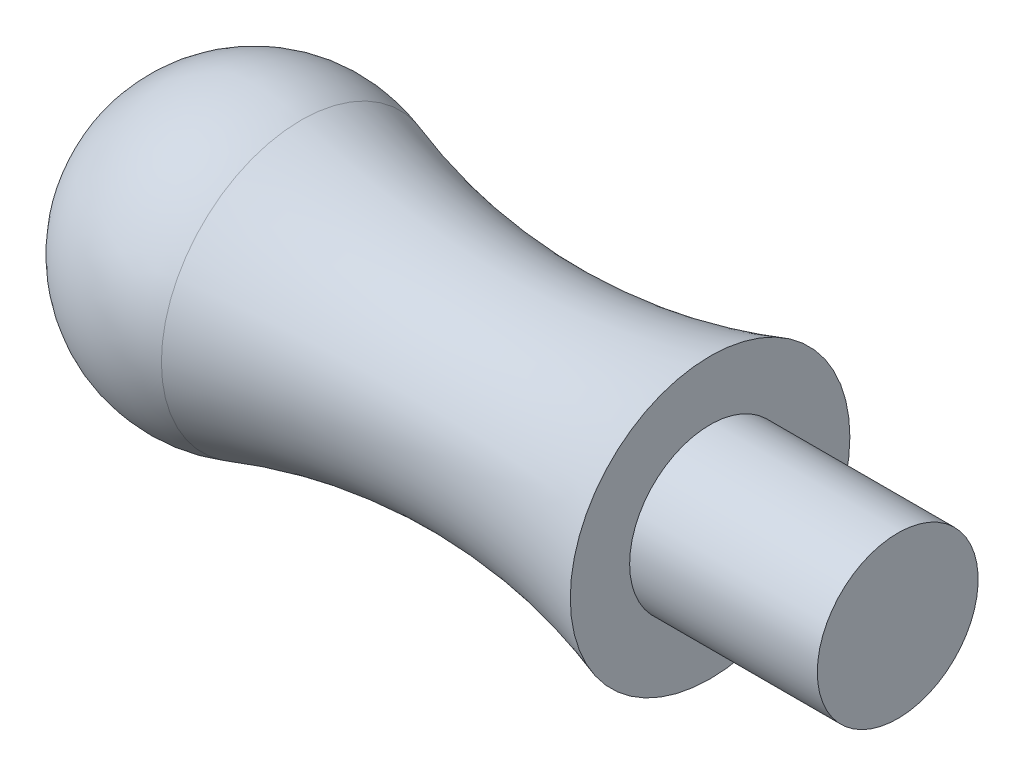
ISO-10303-21;
HEADER;
FILE_DESCRIPTION(('STEP AP214'),'2;1');
FILE_NAME('part.step','',(''),(''),'','','');
FILE_SCHEMA(('AUTOMOTIVE_DESIGN { 1 0 10303 214 1 1 1 1 }'));
ENDSEC;
DATA;
#1=APPLICATION_CONTEXT('core data for automotive mechanical design processes');
#2=APPLICATION_PROTOCOL_DEFINITION('international standard','automotive_design',2000,#1);
#3=PRODUCT_CONTEXT('',#1,'mechanical');
#4=PRODUCT('Part','Part','',(#3));
#5=PRODUCT_RELATED_PRODUCT_CATEGORY('part','',(#4));
#6=PRODUCT_DEFINITION_FORMATION('','',#4);
#7=PRODUCT_DEFINITION_CONTEXT('part definition',#1,'design');
#8=PRODUCT_DEFINITION('design','',#6,#7);
#9=PRODUCT_DEFINITION_SHAPE('','',#8);
#10=(LENGTH_UNIT() NAMED_UNIT(*) SI_UNIT(.MILLI.,.METRE.));
#11=(NAMED_UNIT(*) PLANE_ANGLE_UNIT() SI_UNIT($,.RADIAN.));
#12=(NAMED_UNIT(*) SI_UNIT($,.STERADIAN.) SOLID_ANGLE_UNIT());
#13=UNCERTAINTY_MEASURE_WITH_UNIT(LENGTH_MEASURE(1.E-05),#10,'distance_accuracy_value','');
#14=(GEOMETRIC_REPRESENTATION_CONTEXT(3) GLOBAL_UNCERTAINTY_ASSIGNED_CONTEXT((#13)) GLOBAL_UNIT_ASSIGNED_CONTEXT((#10,
#11,#12)) REPRESENTATION_CONTEXT('',''));
#15=CARTESIAN_POINT('',(0.,0.,0.));
#16=DIRECTION('',(0.,0.,1.));
#17=DIRECTION('',(1.,0.,0.));
#18=AXIS2_PLACEMENT_3D('',#15,#16,#17);
#19=CARTESIAN_POINT('',(0.,0.,0.));
#20=DIRECTION('',(-1.,0.,0.));
#21=DIRECTION('',(0.,1.,0.));
#22=AXIS2_PLACEMENT_3D('',#19,#20,#21);
#23=SPHERICAL_SURFACE('',#22,5.5);
#24=CARTESIAN_POINT('',(1.74766355140188,0.,0.));
#25=DIRECTION('',(-1.,0.,0.));
#26=DIRECTION('',(0.,0.,1.));
#27=AXIS2_PLACEMENT_3D('',#24,#25,#26);
#28=CIRCLE('',#27,5.21494699024845);
#29=CARTESIAN_POINT('',(1.74766355140188,0.,5.21494699024845));
#30=VERTEX_POINT('',#29);
#31=EDGE_CURVE('E48',#30,#30,#28,.T.);
#32=ORIENTED_EDGE('',*,*,#31,.T.);
#33=EDGE_LOOP('',(#32));
#34=FACE_BOUND('',#33,.T.);
#35=ADVANCED_FACE('F34',(#34),#23,.T.);
#36=CARTESIAN_POINT('',(24.,0.,0.));
#37=DIRECTION('',(-1.,0.,0.));
#38=DIRECTION('',(0.,0.,1.));
#39=AXIS2_PLACEMENT_3D('',#36,#37,#38);
#40=PLANE('',#39);
#41=CARTESIAN_POINT('',(24.,0.,0.));
#42=DIRECTION('',(-1.,0.,0.));
#43=DIRECTION('',(0.,0.,1.));
#44=AXIS2_PLACEMENT_3D('',#41,#42,#43);
#45=CIRCLE('',#44,3.);
#46=CARTESIAN_POINT('',(24.,0.,3.));
#47=VERTEX_POINT('',#46);
#48=EDGE_CURVE('E10',#47,#47,#45,.T.);
#49=ORIENTED_EDGE('',*,*,#48,.F.);
#50=EDGE_LOOP('',(#49));
#51=FACE_BOUND('',#50,.T.);
#52=ADVANCED_FACE('F68',(#51),#40,.F.);
#53=CARTESIAN_POINT('',(0.,0.,0.));
#54=DIRECTION('',(-1.,0.,0.));
#55=DIRECTION('',(0.,0.,1.));
#56=AXIS2_PLACEMENT_3D('',#53,#54,#55);
#57=CYLINDRICAL_SURFACE('',#56,3.);
#58=CARTESIAN_POINT('',(17.,0.,0.));
#59=DIRECTION('',(-1.,0.,0.));
#60=DIRECTION('',(0.,0.,1.));
#61=AXIS2_PLACEMENT_3D('',#58,#59,#60);
#62=CIRCLE('',#61,3.);
#63=CARTESIAN_POINT('',(17.,0.,3.));
#64=VERTEX_POINT('',#63);
#65=EDGE_CURVE('E40',#64,#64,#62,.T.);
#66=ORIENTED_EDGE('',*,*,#65,.F.);
#67=EDGE_LOOP('',(#66));
#68=FACE_BOUND('',#67,.T.);
#69=ORIENTED_EDGE('',*,*,#48,.T.);
#70=EDGE_LOOP('',(#69));
#71=FACE_BOUND('',#70,.T.);
#72=ADVANCED_FACE('F63',(#68,#71),#57,.T.);
#73=CARTESIAN_POINT('',(17.,3.,0.));
#74=DIRECTION('',(-1.,0.,0.));
#75=DIRECTION('',(0.,0.,1.));
#76=AXIS2_PLACEMENT_3D('',#73,#74,#75);
#77=PLANE('',#76);
#78=CARTESIAN_POINT('',(17.,0.,0.));
#79=DIRECTION('',(-1.,0.,0.));
#80=DIRECTION('',(0.,0.,1.));
#81=AXIS2_PLACEMENT_3D('',#78,#79,#80);
#82=CIRCLE('',#81,5.21494699024845);
#83=CARTESIAN_POINT('',(17.,0.,5.21494699024845));
#84=VERTEX_POINT('',#83);
#85=EDGE_CURVE('E44',#84,#84,#82,.T.);
#86=ORIENTED_EDGE('',*,*,#85,.F.);
#87=EDGE_LOOP('',(#86));
#88=FACE_BOUND('',#87,.T.);
#89=ORIENTED_EDGE('',*,*,#65,.T.);
#90=EDGE_LOOP('',(#89));
#91=FACE_BOUND('',#90,.T.);
#92=ADVANCED_FACE('F58',(#88,#91),#77,.F.);
#93=CARTESIAN_POINT('',(9.37383177570094,0.,0.));
#94=DIRECTION('',(-1.,0.,0.));
#95=DIRECTION('',(0.,0.,1.));
#96=AXIS2_PLACEMENT_3D('',#93,#94,#95);
#97=TOROIDAL_SURFACE('',#96,27.9710793113326,24.);
#98=ORIENTED_EDGE('',*,*,#31,.F.);
#99=EDGE_LOOP('',(#98));
#100=FACE_BOUND('',#99,.T.);
#101=ORIENTED_EDGE('',*,*,#85,.T.);
#102=EDGE_LOOP('',(#101));
#103=FACE_BOUND('',#102,.T.);
#104=ADVANCED_FACE('F55',(#100,#103),#97,.F.);
#105=CLOSED_SHELL('',(#35,#52,#72,#92,#104));
#106=MANIFOLD_SOLID_BREP('B2',#105);
#107=ADVANCED_BREP_SHAPE_REPRESENTATION('',(#18,#106),#14);
#108=SHAPE_DEFINITION_REPRESENTATION(#9,#107);
ENDSEC;
END-ISO-10303-21;
